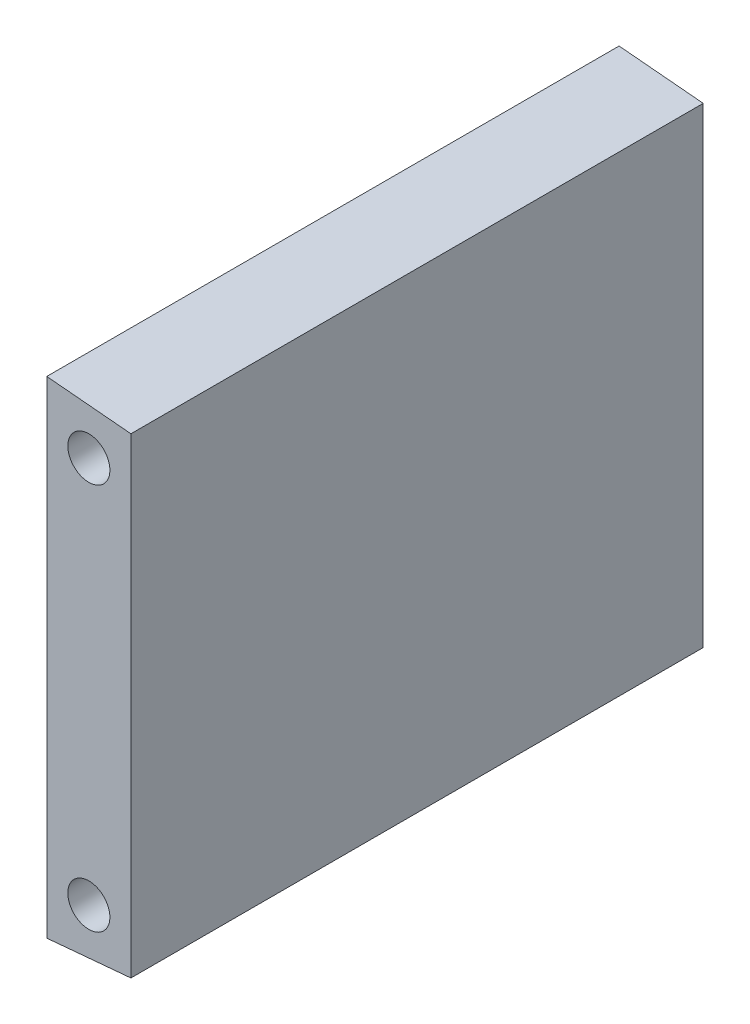
ISO-10303-21;
HEADER;
FILE_DESCRIPTION(('STEP AP214'),'2;1');
FILE_NAME('part.step','',(''),(''),'','','');
FILE_SCHEMA(('AUTOMOTIVE_DESIGN { 1 0 10303 214 1 1 1 1 }'));
ENDSEC;
DATA;
#1=APPLICATION_CONTEXT('core data for automotive mechanical design processes');
#2=APPLICATION_PROTOCOL_DEFINITION('international standard','automotive_design',2000,#1);
#3=PRODUCT_CONTEXT('',#1,'mechanical');
#4=PRODUCT('Part','Part','',(#3));
#5=PRODUCT_RELATED_PRODUCT_CATEGORY('part','',(#4));
#6=PRODUCT_DEFINITION_FORMATION('','',#4);
#7=PRODUCT_DEFINITION_CONTEXT('part definition',#1,'design');
#8=PRODUCT_DEFINITION('design','',#6,#7);
#9=PRODUCT_DEFINITION_SHAPE('','',#8);
#10=(LENGTH_UNIT() NAMED_UNIT(*) SI_UNIT(.MILLI.,.METRE.));
#11=(NAMED_UNIT(*) PLANE_ANGLE_UNIT() SI_UNIT($,.RADIAN.));
#12=(NAMED_UNIT(*) SI_UNIT($,.STERADIAN.) SOLID_ANGLE_UNIT());
#13=UNCERTAINTY_MEASURE_WITH_UNIT(LENGTH_MEASURE(1.E-05),#10,'distance_accuracy_value','');
#14=(GEOMETRIC_REPRESENTATION_CONTEXT(3) GLOBAL_UNCERTAINTY_ASSIGNED_CONTEXT((#13)) GLOBAL_UNIT_ASSIGNED_CONTEXT((#10,
#11,#12)) REPRESENTATION_CONTEXT('',''));
#15=CARTESIAN_POINT('',(0.,0.,0.));
#16=DIRECTION('',(0.,0.,1.));
#17=DIRECTION('',(1.,0.,0.));
#18=AXIS2_PLACEMENT_3D('',#15,#16,#17);
#19=CARTESIAN_POINT('',(0.,-23.,80.));
#20=DIRECTION('',(0.,0.,-1.));
#21=DIRECTION('',(-1.,0.,0.));
#22=AXIS2_PLACEMENT_3D('',#19,#20,#21);
#23=CYLINDRICAL_SURFACE('',#22,2.5);
#24=CARTESIAN_POINT('',(0.,-23.,0.));
#25=DIRECTION('',(0.,0.,1.));
#26=DIRECTION('',(1.,0.,0.));
#27=AXIS2_PLACEMENT_3D('',#24,#25,#26);
#28=CIRCLE('',#27,2.5);
#29=CARTESIAN_POINT('',(2.50000000000001,-23.,0.));
#30=VERTEX_POINT('',#29);
#31=EDGE_CURVE('E111',#30,#30,#28,.T.);
#32=ORIENTED_EDGE('',*,*,#31,.F.);
#33=EDGE_LOOP('',(#32));
#34=FACE_BOUND('',#33,.T.);
#35=CARTESIAN_POINT('',(0.,-23.,5.99999999999999));
#36=DIRECTION('',(0.,0.,1.));
#37=DIRECTION('',(1.,0.,0.));
#38=AXIS2_PLACEMENT_3D('',#35,#36,#37);
#39=CIRCLE('',#38,2.5);
#40=CARTESIAN_POINT('',(2.50000000000001,-23.,5.99999999999999));
#41=VERTEX_POINT('',#40);
#42=EDGE_CURVE('E117',#41,#41,#39,.T.);
#43=ORIENTED_EDGE('',*,*,#42,.T.);
#44=EDGE_LOOP('',(#43));
#45=FACE_BOUND('',#44,.T.);
#46=ADVANCED_FACE('F33',(#34,#45),#23,.F.);
#47=CARTESIAN_POINT('',(0.,23.,80.));
#48=DIRECTION('',(0.,0.,-1.));
#49=DIRECTION('',(-1.,0.,0.));
#50=AXIS2_PLACEMENT_3D('',#47,#48,#49);
#51=CYLINDRICAL_SURFACE('',#50,2.5);
#52=CARTESIAN_POINT('',(0.,23.,0.));
#53=DIRECTION('',(0.,0.,1.));
#54=DIRECTION('',(1.,0.,0.));
#55=AXIS2_PLACEMENT_3D('',#52,#53,#54);
#56=CIRCLE('',#55,2.5);
#57=CARTESIAN_POINT('',(2.5,23.,0.));
#58=VERTEX_POINT('',#57);
#59=EDGE_CURVE('E106',#58,#58,#56,.T.);
#60=ORIENTED_EDGE('',*,*,#59,.F.);
#61=EDGE_LOOP('',(#60));
#62=FACE_BOUND('',#61,.T.);
#63=CARTESIAN_POINT('',(0.,23.,5.99999999999999));
#64=DIRECTION('',(0.,0.,1.));
#65=DIRECTION('',(1.,0.,0.));
#66=AXIS2_PLACEMENT_3D('',#63,#64,#65);
#67=CIRCLE('',#66,2.5);
#68=CARTESIAN_POINT('',(2.5,23.,5.99999999999999));
#69=VERTEX_POINT('',#68);
#70=EDGE_CURVE('E114',#69,#69,#67,.T.);
#71=ORIENTED_EDGE('',*,*,#70,.T.);
#72=EDGE_LOOP('',(#71));
#73=FACE_BOUND('',#72,.T.);
#74=ADVANCED_FACE('F161',(#62,#73),#51,.F.);
#75=CARTESIAN_POINT('',(5.,0.,80.));
#76=DIRECTION('',(1.,0.,0.));
#77=DIRECTION('',(0.,1.,0.));
#78=AXIS2_PLACEMENT_3D('',#75,#76,#77);
#79=PLANE('',#78);
#80=DIRECTION('',(0.,1.,0.));
#81=VECTOR('',#80,1.);
#82=CARTESIAN_POINT('',(5.,28.,68.));
#83=LINE('',#82,#81);
#84=CARTESIAN_POINT('',(5.,-28.,68.));
#85=VERTEX_POINT('',#84);
#86=CARTESIAN_POINT('',(5.,28.,68.));
#87=VERTEX_POINT('',#86);
#88=EDGE_CURVE('E73',#85,#87,#83,.T.);
#89=ORIENTED_EDGE('',*,*,#88,.F.);
#90=DIRECTION('',(0.,0.,-1.));
#91=VECTOR('',#90,1.);
#92=CARTESIAN_POINT('',(5.,-28.,80.));
#93=LINE('',#92,#91);
#94=CARTESIAN_POINT('',(5.,-28.,0.));
#95=VERTEX_POINT('',#94);
#96=EDGE_CURVE('E55',#85,#95,#93,.T.);
#97=ORIENTED_EDGE('',*,*,#96,.T.);
#98=DIRECTION('',(0.,-1.,0.));
#99=VECTOR('',#98,1.);
#100=CARTESIAN_POINT('',(5.,0.,0.));
#101=LINE('',#100,#99);
#102=CARTESIAN_POINT('',(5.,28.,0.));
#103=VERTEX_POINT('',#102);
#104=EDGE_CURVE('E104',#103,#95,#101,.T.);
#105=ORIENTED_EDGE('',*,*,#104,.F.);
#106=DIRECTION('',(0.,0.,-1.));
#107=VECTOR('',#106,1.);
#108=CARTESIAN_POINT('',(5.,28.,80.));
#109=LINE('',#108,#107);
#110=EDGE_CURVE('E11',#87,#103,#109,.T.);
#111=ORIENTED_EDGE('',*,*,#110,.F.);
#112=EDGE_LOOP('',(#89,#97,#105,#111));
#113=FACE_BOUND('',#112,.T.);
#114=ADVANCED_FACE('F79',(#113),#79,.T.);
#115=CARTESIAN_POINT('',(2.53992659458404,28.2214066064875,80.));
#116=DIRECTION('',(-0.0896376994958966,-0.995974438843228,0.));
#117=DIRECTION('',(0.995974438843228,-0.0896376994958966,0.));
#118=AXIS2_PLACEMENT_3D('',#115,#116,#117);
#119=PLANE('',#118);
#120=DIRECTION('',(0.,0.,-1.));
#121=VECTOR('',#120,1.);
#122=CARTESIAN_POINT('',(-4.99999999999999,28.9000000000001,80.));
#123=LINE('',#122,#121);
#124=CARTESIAN_POINT('',(-4.99999999999999,28.9000000000001,68.));
#125=VERTEX_POINT('',#124);
#126=CARTESIAN_POINT('',(-4.99999999999999,28.9000000000001,0.));
#127=VERTEX_POINT('',#126);
#128=EDGE_CURVE('E40',#125,#127,#123,.T.);
#129=ORIENTED_EDGE('',*,*,#128,.F.);
#130=DIRECTION('',(-0.995974438843228,0.0896376994958966,0.));
#131=VECTOR('',#130,1.);
#132=CARTESIAN_POINT('',(-4.99999999999999,28.9000000000001,68.));
#133=LINE('',#132,#131);
#134=EDGE_CURVE('E80',#87,#125,#133,.T.);
#135=ORIENTED_EDGE('',*,*,#134,.F.);
#136=ORIENTED_EDGE('',*,*,#110,.T.);
#137=DIRECTION('',(-0.995974438843228,0.0896376994958967,0.));
#138=VECTOR('',#137,1.);
#139=CARTESIAN_POINT('',(2.53992659458404,28.2214066064875,0.));
#140=LINE('',#139,#138);
#141=EDGE_CURVE('E102',#103,#127,#140,.T.);
#142=ORIENTED_EDGE('',*,*,#141,.T.);
#143=EDGE_LOOP('',(#129,#135,#136,#142));
#144=FACE_BOUND('',#143,.T.);
#145=ADVANCED_FACE('F103',(#144),#119,.F.);
#146=CARTESIAN_POINT('',(-4.99999999999999,0.,80.));
#147=DIRECTION('',(1.,0.,0.));
#148=DIRECTION('',(0.,1.,0.));
#149=AXIS2_PLACEMENT_3D('',#146,#147,#148);
#150=PLANE('',#149);
#151=DIRECTION('',(0.,0.,-1.));
#152=VECTOR('',#151,1.);
#153=CARTESIAN_POINT('',(-4.99999999999999,-28.8999999999999,80.));
#154=LINE('',#153,#152);
#155=CARTESIAN_POINT('',(-4.99999999999999,-28.8999999999999,68.));
#156=VERTEX_POINT('',#155);
#157=CARTESIAN_POINT('',(-4.99999999999999,-28.8999999999999,0.));
#158=VERTEX_POINT('',#157);
#159=EDGE_CURVE('E86',#156,#158,#154,.T.);
#160=ORIENTED_EDGE('',*,*,#159,.F.);
#161=DIRECTION('',(0.,-1.,0.));
#162=VECTOR('',#161,1.);
#163=CARTESIAN_POINT('',(-4.99999999999999,-28.8999999999999,68.));
#164=LINE('',#163,#162);
#165=EDGE_CURVE('E47',#125,#156,#164,.T.);
#166=ORIENTED_EDGE('',*,*,#165,.F.);
#167=ORIENTED_EDGE('',*,*,#128,.T.);
#168=DIRECTION('',(0.,-1.,0.));
#169=VECTOR('',#168,1.);
#170=CARTESIAN_POINT('',(-4.99999999999999,0.,0.));
#171=LINE('',#170,#169);
#172=EDGE_CURVE('E89',#127,#158,#171,.T.);
#173=ORIENTED_EDGE('',*,*,#172,.T.);
#174=EDGE_LOOP('',(#160,#166,#167,#173));
#175=FACE_BOUND('',#174,.T.);
#176=ADVANCED_FACE('F96',(#175),#150,.F.);
#177=CARTESIAN_POINT('',(2.53992659458373,-28.2214066064875,80.));
#178=DIRECTION('',(0.0896376994958857,-0.995974438843229,0.));
#179=DIRECTION('',(0.995974438843229,0.0896376994958857,0.));
#180=AXIS2_PLACEMENT_3D('',#177,#178,#179);
#181=PLANE('',#180);
#182=DIRECTION('',(0.995974438843229,0.0896376994958857,0.));
#183=VECTOR('',#182,1.);
#184=CARTESIAN_POINT('',(5.,-28.,68.));
#185=LINE('',#184,#183);
#186=EDGE_CURVE('E71',#156,#85,#185,.T.);
#187=ORIENTED_EDGE('',*,*,#186,.F.);
#188=ORIENTED_EDGE('',*,*,#159,.T.);
#189=DIRECTION('',(-0.995974438843229,-0.0896376994958857,0.));
#190=VECTOR('',#189,1.);
#191=CARTESIAN_POINT('',(2.53992659458373,-28.2214066064875,0.));
#192=LINE('',#191,#190);
#193=EDGE_CURVE('E85',#95,#158,#192,.T.);
#194=ORIENTED_EDGE('',*,*,#193,.F.);
#195=ORIENTED_EDGE('',*,*,#96,.F.);
#196=EDGE_LOOP('',(#187,#188,#194,#195));
#197=FACE_BOUND('',#196,.T.);
#198=ADVANCED_FACE('F83',(#197),#181,.T.);
#199=CARTESIAN_POINT('',(0.,0.,0.));
#200=DIRECTION('',(0.,0.,1.));
#201=DIRECTION('',(1.,0.,0.));
#202=AXIS2_PLACEMENT_3D('',#199,#200,#201);
#203=PLANE('',#202);
#204=ORIENTED_EDGE('',*,*,#31,.T.);
#205=EDGE_LOOP('',(#204));
#206=FACE_BOUND('',#205,.T.);
#207=ORIENTED_EDGE('',*,*,#59,.T.);
#208=EDGE_LOOP('',(#207));
#209=FACE_BOUND('',#208,.T.);
#210=ORIENTED_EDGE('',*,*,#104,.T.);
#211=ORIENTED_EDGE('',*,*,#193,.T.);
#212=ORIENTED_EDGE('',*,*,#172,.F.);
#213=ORIENTED_EDGE('',*,*,#141,.F.);
#214=EDGE_LOOP('',(#210,#211,#212,#213));
#215=FACE_BOUND('',#214,.T.);
#216=ADVANCED_FACE('F101',(#206,#209,#215),#203,.F.);
#217=CARTESIAN_POINT('',(0.,23.,5.99999999999999));
#218=DIRECTION('',(0.,0.,1.));
#219=DIRECTION('',(1.,0.,0.));
#220=AXIS2_PLACEMENT_3D('',#217,#218,#219);
#221=PLANE('',#220);
#222=ORIENTED_EDGE('',*,*,#70,.F.);
#223=EDGE_LOOP('',(#222));
#224=FACE_BOUND('',#223,.T.);
#225=ADVANCED_FACE('F172',(#224),#221,.F.);
#226=CARTESIAN_POINT('',(0.,-23.,5.99999999999999));
#227=DIRECTION('',(0.,0.,1.));
#228=DIRECTION('',(1.,0.,0.));
#229=AXIS2_PLACEMENT_3D('',#226,#227,#228);
#230=PLANE('',#229);
#231=ORIENTED_EDGE('',*,*,#42,.F.);
#232=EDGE_LOOP('',(#231));
#233=FACE_BOUND('',#232,.T.);
#234=ADVANCED_FACE('F147',(#233),#230,.F.);
#235=CARTESIAN_POINT('',(0.,0.,68.));
#236=DIRECTION('',(0.,0.,-1.));
#237=DIRECTION('',(-1.,0.,0.));
#238=AXIS2_PLACEMENT_3D('',#235,#236,#237);
#239=PLANE('',#238);
#240=CARTESIAN_POINT('',(0.,23.,68.));
#241=DIRECTION('',(0.,0.,1.));
#242=DIRECTION('',(1.,0.,0.));
#243=AXIS2_PLACEMENT_3D('',#240,#241,#242);
#244=CIRCLE('',#243,2.5);
#245=CARTESIAN_POINT('',(2.5,23.,68.));
#246=VERTEX_POINT('',#245);
#247=EDGE_CURVE('E129',#246,#246,#244,.T.);
#248=ORIENTED_EDGE('',*,*,#247,.F.);
#249=EDGE_LOOP('',(#248));
#250=FACE_BOUND('',#249,.T.);
#251=CARTESIAN_POINT('',(0.,-23.,68.));
#252=DIRECTION('',(0.,0.,1.));
#253=DIRECTION('',(1.,0.,0.));
#254=AXIS2_PLACEMENT_3D('',#251,#252,#253);
#255=CIRCLE('',#254,2.5);
#256=CARTESIAN_POINT('',(2.50000000000001,-23.,68.));
#257=VERTEX_POINT('',#256);
#258=EDGE_CURVE('E123',#257,#257,#255,.T.);
#259=ORIENTED_EDGE('',*,*,#258,.F.);
#260=EDGE_LOOP('',(#259));
#261=FACE_BOUND('',#260,.T.);
#262=ORIENTED_EDGE('',*,*,#165,.T.);
#263=ORIENTED_EDGE('',*,*,#186,.T.);
#264=ORIENTED_EDGE('',*,*,#88,.T.);
#265=ORIENTED_EDGE('',*,*,#134,.T.);
#266=EDGE_LOOP('',(#262,#263,#264,#265));
#267=FACE_BOUND('',#266,.T.);
#268=ADVANCED_FACE('F72',(#250,#261,#267),#239,.F.);
#269=CARTESIAN_POINT('',(0.,-23.,62.));
#270=DIRECTION('',(0.,0.,1.));
#271=DIRECTION('',(1.,0.,0.));
#272=AXIS2_PLACEMENT_3D('',#269,#270,#271);
#273=CYLINDRICAL_SURFACE('',#272,2.5);
#274=CARTESIAN_POINT('',(0.,-23.,62.));
#275=DIRECTION('',(0.,0.,1.));
#276=DIRECTION('',(1.,0.,0.));
#277=AXIS2_PLACEMENT_3D('',#274,#275,#276);
#278=CIRCLE('',#277,2.5);
#279=CARTESIAN_POINT('',(2.50000000000001,-23.,62.));
#280=VERTEX_POINT('',#279);
#281=EDGE_CURVE('E126',#280,#280,#278,.T.);
#282=ORIENTED_EDGE('',*,*,#281,.F.);
#283=EDGE_LOOP('',(#282));
#284=FACE_BOUND('',#283,.T.);
#285=ORIENTED_EDGE('',*,*,#258,.T.);
#286=EDGE_LOOP('',(#285));
#287=FACE_BOUND('',#286,.T.);
#288=ADVANCED_FACE('F146',(#284,#287),#273,.F.);
#289=CARTESIAN_POINT('',(0.,0.,62.));
#290=DIRECTION('',(0.,0.,1.));
#291=DIRECTION('',(1.,0.,0.));
#292=AXIS2_PLACEMENT_3D('',#289,#290,#291);
#293=PLANE('',#292);
#294=ORIENTED_EDGE('',*,*,#281,.T.);
#295=EDGE_LOOP('',(#294));
#296=FACE_BOUND('',#295,.T.);
#297=ADVANCED_FACE('F140',(#296),#293,.T.);
#298=CARTESIAN_POINT('',(0.,23.,62.));
#299=DIRECTION('',(0.,0.,1.));
#300=DIRECTION('',(1.,0.,0.));
#301=AXIS2_PLACEMENT_3D('',#298,#299,#300);
#302=CYLINDRICAL_SURFACE('',#301,2.5);
#303=CARTESIAN_POINT('',(0.,23.,62.));
#304=DIRECTION('',(0.,0.,1.));
#305=DIRECTION('',(1.,0.,0.));
#306=AXIS2_PLACEMENT_3D('',#303,#304,#305);
#307=CIRCLE('',#306,2.5);
#308=CARTESIAN_POINT('',(2.5,23.,62.));
#309=VERTEX_POINT('',#308);
#310=EDGE_CURVE('E122',#309,#309,#307,.T.);
#311=ORIENTED_EDGE('',*,*,#310,.F.);
#312=EDGE_LOOP('',(#311));
#313=FACE_BOUND('',#312,.T.);
#314=ORIENTED_EDGE('',*,*,#247,.T.);
#315=EDGE_LOOP('',(#314));
#316=FACE_BOUND('',#315,.T.);
#317=ADVANCED_FACE('F137',(#313,#316),#302,.F.);
#318=CARTESIAN_POINT('',(0.,0.,62.));
#319=DIRECTION('',(0.,0.,1.));
#320=DIRECTION('',(1.,0.,0.));
#321=AXIS2_PLACEMENT_3D('',#318,#319,#320);
#322=PLANE('',#321);
#323=ORIENTED_EDGE('',*,*,#310,.T.);
#324=EDGE_LOOP('',(#323));
#325=FACE_BOUND('',#324,.T.);
#326=ADVANCED_FACE('F135',(#325),#322,.T.);
#327=CLOSED_SHELL('',(#46,#74,#114,#145,#176,#198,#216,#225,#234,#268,#288,#297,#317,#326));
#328=MANIFOLD_SOLID_BREP('B2',#327);
#329=ADVANCED_BREP_SHAPE_REPRESENTATION('',(#18,#328),#14);
#330=SHAPE_DEFINITION_REPRESENTATION(#9,#329);
ENDSEC;
END-ISO-10303-21;
